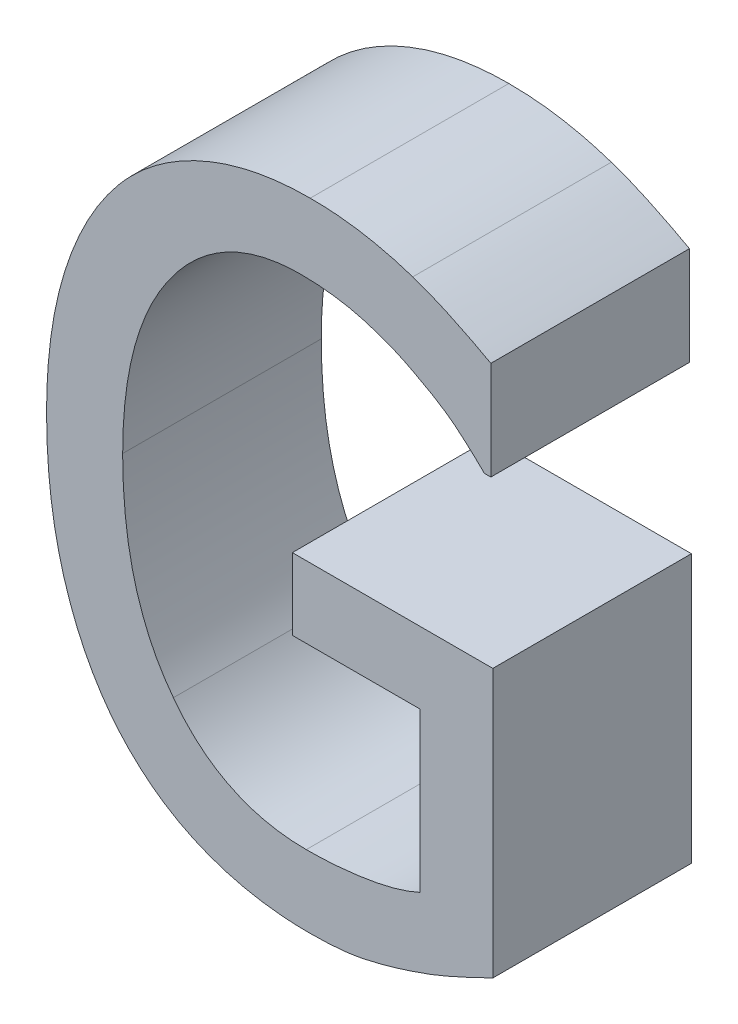
ISO-10303-21;
HEADER;
FILE_DESCRIPTION(('STEP AP214'),'2;1');
FILE_NAME('part.step','',(''),(''),'','','');
FILE_SCHEMA(('AUTOMOTIVE_DESIGN { 1 0 10303 214 1 1 1 1 }'));
ENDSEC;
DATA;
#1=APPLICATION_CONTEXT('core data for automotive mechanical design processes');
#2=APPLICATION_PROTOCOL_DEFINITION('international standard','automotive_design',2000,#1);
#3=PRODUCT_CONTEXT('',#1,'mechanical');
#4=PRODUCT('Part','Part','',(#3));
#5=PRODUCT_RELATED_PRODUCT_CATEGORY('part','',(#4));
#6=PRODUCT_DEFINITION_FORMATION('','',#4);
#7=PRODUCT_DEFINITION_CONTEXT('part definition',#1,'design');
#8=PRODUCT_DEFINITION('design','',#6,#7);
#9=PRODUCT_DEFINITION_SHAPE('','',#8);
#10=(LENGTH_UNIT() NAMED_UNIT(*) SI_UNIT(.MILLI.,.METRE.));
#11=(NAMED_UNIT(*) PLANE_ANGLE_UNIT() SI_UNIT($,.RADIAN.));
#12=(NAMED_UNIT(*) SI_UNIT($,.STERADIAN.) SOLID_ANGLE_UNIT());
#13=UNCERTAINTY_MEASURE_WITH_UNIT(LENGTH_MEASURE(1.E-05),#10,'distance_accuracy_value','');
#14=(GEOMETRIC_REPRESENTATION_CONTEXT(3) GLOBAL_UNCERTAINTY_ASSIGNED_CONTEXT((#13)) GLOBAL_UNIT_ASSIGNED_CONTEXT((#10,
#11,#12)) REPRESENTATION_CONTEXT('',''));
#15=CARTESIAN_POINT('',(0.,0.,0.));
#16=DIRECTION('',(0.,0.,1.));
#17=DIRECTION('',(1.,0.,0.));
#18=AXIS2_PLACEMENT_3D('',#15,#16,#17);
#19=CARTESIAN_POINT('',(-2.688889723779,0.344229422438077,0.));
#20=CARTESIAN_POINT('',(-2.688889723779,0.344229422438077,0.1));
#21=CARTESIAN_POINT('',(-2.688889723779,0.304902672714159,0.));
#22=CARTESIAN_POINT('',(-2.688889723779,0.304902672714159,0.1));
#23=CARTESIAN_POINT('',(-2.670103059898,0.244284370591941,0.));
#24=CARTESIAN_POINT('',(-2.670103059898,0.244284370591941,0.1));
#25=CARTESIAN_POINT('',(-2.652568840276,0.223744284748876,0.));
#26=CARTESIAN_POINT('',(-2.652568840276,0.223744284748876,0.1));
#27=B_SPLINE_SURFACE_WITH_KNOTS('',2,1,((#19,#20),(#21,#22),(#23,#24),(#25,#26)),.UNSPECIFIED.,
.F.,.F.,.F.,(3,1,3),(2,2),(-2.,-1.,0.),(0.,0.01),.UNSPECIFIED.);
#28=CARTESIAN_POINT('',(-2.652568840276,0.223744284748876,0.));
#29=CARTESIAN_POINT('',(-2.670103059898,0.244284370591941,0.));
#30=CARTESIAN_POINT('',(-2.688889723779,0.304902672714159,0.));
#31=CARTESIAN_POINT('',(-2.688889723779,0.344229422438077,0.));
#32=B_SPLINE_CURVE_WITH_KNOTS('',2,(#28,#29,#30,#31),.UNSPECIFIED.,.F.,.F.,(3,1,3),(0.,1.,2.),.UNSPECIFIED.);
#33=CARTESIAN_POINT('',(-2.652568840276,0.223744284748876,0.));
#34=VERTEX_POINT('',#33);
#35=CARTESIAN_POINT('',(-2.688889723779,0.344229422438077,0.));
#36=VERTEX_POINT('',#35);
#37=EDGE_CURVE('E11',#34,#36,#32,.T.);
#38=DIRECTION('',(0.,0.,1.));
#39=VECTOR('',#38,1.);
#40=CARTESIAN_POINT('',(-2.652568840276,0.223744284748876,0.));
#41=LINE('',#40,#39);
#42=CARTESIAN_POINT('',(-2.652568840276,0.223744284748876,0.1));
#43=VERTEX_POINT('',#42);
#44=EDGE_CURVE('E28',#34,#43,#41,.T.);
#45=CARTESIAN_POINT('',(-2.688889723779,0.344229422438077,0.1));
#46=CARTESIAN_POINT('',(-2.688889723779,0.304902672714159,0.1));
#47=CARTESIAN_POINT('',(-2.670103059898,0.244284370591941,0.1));
#48=CARTESIAN_POINT('',(-2.652568840276,0.223744284748876,0.1));
#49=B_SPLINE_CURVE_WITH_KNOTS('',2,(#45,#46,#47,#48),.UNSPECIFIED.,.F.,.F.,(3,1,3),(-2.,-1.,0.),.UNSPECIFIED.);
#50=CARTESIAN_POINT('',(-2.688889723779,0.344229422438077,0.1));
#51=VERTEX_POINT('',#50);
#52=EDGE_CURVE('E182',#51,#43,#49,.T.);
#53=DIRECTION('',(0.,0.,1.));
#54=VECTOR('',#53,1.);
#55=CARTESIAN_POINT('',(-2.688889723779,0.344229422438077,0.));
#56=LINE('',#55,#54);
#57=EDGE_CURVE('E454',#36,#51,#56,.T.);
#58=ORIENTED_EDGE('',*,*,#37,.F.);
#59=ORIENTED_EDGE('',*,*,#44,.T.);
#60=ORIENTED_EDGE('',*,*,#52,.F.);
#61=ORIENTED_EDGE('',*,*,#57,.F.);
#62=EDGE_LOOP('',(#58,#59,#60,#61));
#63=FACE_BOUND('',#62,.T.);
#64=ADVANCED_FACE('F17',(#63),#27,.T.);
#65=CARTESIAN_POINT('',(-2.652568840276,0.461708693906341,0.));
#66=CARTESIAN_POINT('',(-2.652568840276,0.461708693906341,0.1));
#67=CARTESIAN_POINT('',(-2.670103059898,0.440667630359786,0.));
#68=CARTESIAN_POINT('',(-2.670103059898,0.440667630359786,0.1));
#69=CARTESIAN_POINT('',(-2.688889723779,0.381552261348037,0.));
#70=CARTESIAN_POINT('',(-2.688889723779,0.381552261348037,0.1));
#71=CARTESIAN_POINT('',(-2.688889723779,0.344229422438077,0.));
#72=CARTESIAN_POINT('',(-2.688889723779,0.344229422438077,0.1));
#73=B_SPLINE_SURFACE_WITH_KNOTS('',2,1,((#65,#66),(#67,#68),(#69,#70),(#71,#72)),.UNSPECIFIED.,
.F.,.F.,.F.,(3,1,3),(2,2),(-2.,-1.,0.),(0.,0.01),.UNSPECIFIED.);
#74=CARTESIAN_POINT('',(-2.688889723779,0.344229422438077,0.));
#75=CARTESIAN_POINT('',(-2.688889723779,0.381552261348037,0.));
#76=CARTESIAN_POINT('',(-2.670103059898,0.440667630359786,0.));
#77=CARTESIAN_POINT('',(-2.652568840276,0.461708693906341,0.));
#78=B_SPLINE_CURVE_WITH_KNOTS('',2,(#74,#75,#76,#77),.UNSPECIFIED.,.F.,.F.,(3,1,3),(0.,1.,2.),.UNSPECIFIED.);
#79=CARTESIAN_POINT('',(-2.652568840276,0.461708693906341,0.));
#80=VERTEX_POINT('',#79);
#81=EDGE_CURVE('E447',#36,#80,#78,.T.);
#82=CARTESIAN_POINT('',(-2.652568840276,0.461708693906341,0.1));
#83=CARTESIAN_POINT('',(-2.670103059898,0.440667630359786,0.1));
#84=CARTESIAN_POINT('',(-2.688889723779,0.381552261348037,0.1));
#85=CARTESIAN_POINT('',(-2.688889723779,0.344229422438077,0.1));
#86=B_SPLINE_CURVE_WITH_KNOTS('',2,(#82,#83,#84,#85),.UNSPECIFIED.,.F.,.F.,(3,1,3),(-2.,-1.,0.),.UNSPECIFIED.);
#87=CARTESIAN_POINT('',(-2.652568840276,0.461708693906341,0.1));
#88=VERTEX_POINT('',#87);
#89=EDGE_CURVE('E443',#88,#51,#86,.T.);
#90=DIRECTION('',(0.,0.,1.));
#91=VECTOR('',#90,1.);
#92=CARTESIAN_POINT('',(-2.652568840276,0.461708693906341,0.));
#93=LINE('',#92,#91);
#94=EDGE_CURVE('E437',#80,#88,#93,.T.);
#95=ORIENTED_EDGE('',*,*,#81,.F.);
#96=ORIENTED_EDGE('',*,*,#57,.T.);
#97=ORIENTED_EDGE('',*,*,#89,.F.);
#98=ORIENTED_EDGE('',*,*,#94,.F.);
#99=EDGE_LOOP('',(#95,#96,#97,#98));
#100=FACE_BOUND('',#99,.T.);
#101=ADVANCED_FACE('F536',(#100),#73,.T.);
#102=CARTESIAN_POINT('',(-2.556130632354,0.504041309851195,0.));
#103=CARTESIAN_POINT('',(-2.556130632354,0.504041309851195,0.1));
#104=CARTESIAN_POINT('',(-2.58568831686,0.504041309851195,0.));
#105=CARTESIAN_POINT('',(-2.58568831686,0.504041309851195,0.1));
#106=CARTESIAN_POINT('',(-2.635535598357,0.481998290897661,0.));
#107=CARTESIAN_POINT('',(-2.635535598357,0.481998290897661,0.1));
#108=CARTESIAN_POINT('',(-2.652568840276,0.461708693906341,0.));
#109=CARTESIAN_POINT('',(-2.652568840276,0.461708693906341,0.1));
#110=B_SPLINE_SURFACE_WITH_KNOTS('',2,1,((#102,#103),(#104,#105),(#106,#107),(#108,#109)),
.UNSPECIFIED.,.F.,.F.,.F.,(3,1,3),(2,2),(-2.,-1.,0.),(0.,0.01),.UNSPECIFIED.);
#111=CARTESIAN_POINT('',(-2.652568840276,0.461708693906341,0.));
#112=CARTESIAN_POINT('',(-2.635535598357,0.481998290897661,0.));
#113=CARTESIAN_POINT('',(-2.58568831686,0.504041309851195,0.));
#114=CARTESIAN_POINT('',(-2.556130632354,0.504041309851195,0.));
#115=B_SPLINE_CURVE_WITH_KNOTS('',2,(#111,#112,#113,#114),.UNSPECIFIED.,.F.,.F.,(3,1,3),(0.,1.,
2.),.UNSPECIFIED.);
#116=CARTESIAN_POINT('',(-2.556130632354,0.504041309851195,0.));
#117=VERTEX_POINT('',#116);
#118=EDGE_CURVE('E430',#80,#117,#115,.T.);
#119=CARTESIAN_POINT('',(-2.556130632354,0.504041309851195,0.1));
#120=CARTESIAN_POINT('',(-2.58568831686,0.504041309851195,0.1));
#121=CARTESIAN_POINT('',(-2.635535598357,0.481998290897661,0.1));
#122=CARTESIAN_POINT('',(-2.652568840276,0.461708693906341,0.1));
#123=B_SPLINE_CURVE_WITH_KNOTS('',2,(#119,#120,#121,#122),.UNSPECIFIED.,.F.,.F.,(3,1,3),(-2.,
-1.,0.),.UNSPECIFIED.);
#124=CARTESIAN_POINT('',(-2.556130632354,0.504041309851195,0.1));
#125=VERTEX_POINT('',#124);
#126=EDGE_CURVE('E425',#125,#88,#123,.T.);
#127=DIRECTION('',(0.,0.,1.));
#128=VECTOR('',#127,1.);
#129=CARTESIAN_POINT('',(-2.556130632354,0.504041309851195,0.));
#130=LINE('',#129,#128);
#131=EDGE_CURVE('E419',#117,#125,#130,.T.);
#132=ORIENTED_EDGE('',*,*,#118,.F.);
#133=ORIENTED_EDGE('',*,*,#94,.T.);
#134=ORIENTED_EDGE('',*,*,#126,.F.);
#135=ORIENTED_EDGE('',*,*,#131,.F.);
#136=EDGE_LOOP('',(#132,#133,#134,#135));
#137=FACE_BOUND('',#136,.T.);
#138=ADVANCED_FACE('F532',(#137),#110,.T.);
#139=CARTESIAN_POINT('',(-2.504529928895,0.495524688891875,0.));
#140=CARTESIAN_POINT('',(-2.504529928895,0.495524688891875,0.1));
#141=CARTESIAN_POINT('',(-2.516302904927,0.49953251051979,0.));
#142=CARTESIAN_POINT('',(-2.516302904927,0.49953251051979,0.1));
#143=CARTESIAN_POINT('',(-2.542103256656,0.504041309851195,0.));
#144=CARTESIAN_POINT('',(-2.542103256656,0.504041309851195,0.1));
#145=CARTESIAN_POINT('',(-2.556130632354,0.504041309851195,0.));
#146=CARTESIAN_POINT('',(-2.556130632354,0.504041309851195,0.1));
#147=B_SPLINE_SURFACE_WITH_KNOTS('',2,1,((#139,#140),(#141,#142),(#143,#144),(#145,#146)),
.UNSPECIFIED.,.F.,.F.,.F.,(3,1,3),(2,2),(-2.,-1.,0.),(0.,0.01),.UNSPECIFIED.);
#148=CARTESIAN_POINT('',(-2.556130632354,0.504041309851195,0.));
#149=CARTESIAN_POINT('',(-2.542103256656,0.504041309851195,0.));
#150=CARTESIAN_POINT('',(-2.516302904927,0.49953251051979,0.));
#151=CARTESIAN_POINT('',(-2.504529928895,0.495524688891875,0.));
#152=B_SPLINE_CURVE_WITH_KNOTS('',2,(#148,#149,#150,#151),.UNSPECIFIED.,.F.,.F.,(3,1,3),(0.,1.,
2.),.UNSPECIFIED.);
#153=CARTESIAN_POINT('',(-2.504529928895,0.495524688891875,0.));
#154=VERTEX_POINT('',#153);
#155=EDGE_CURVE('E412',#117,#154,#152,.T.);
#156=CARTESIAN_POINT('',(-2.504529928895,0.495524688891875,0.1));
#157=CARTESIAN_POINT('',(-2.516302904927,0.49953251051979,0.1));
#158=CARTESIAN_POINT('',(-2.542103256656,0.504041309851195,0.1));
#159=CARTESIAN_POINT('',(-2.556130632354,0.504041309851195,0.1));
#160=B_SPLINE_CURVE_WITH_KNOTS('',2,(#156,#157,#158,#159),.UNSPECIFIED.,.F.,.F.,(3,1,3),(-2.,
-1.,0.),.UNSPECIFIED.);
#161=CARTESIAN_POINT('',(-2.504529928895,0.495524688891875,0.1));
#162=VERTEX_POINT('',#161);
#163=EDGE_CURVE('E407',#162,#125,#160,.T.);
#164=DIRECTION('',(0.,0.,1.));
#165=VECTOR('',#164,1.);
#166=CARTESIAN_POINT('',(-2.504529928895,0.495524688891875,0.));
#167=LINE('',#166,#165);
#168=EDGE_CURVE('E401',#154,#162,#167,.T.);
#169=ORIENTED_EDGE('',*,*,#155,.F.);
#170=ORIENTED_EDGE('',*,*,#131,.T.);
#171=ORIENTED_EDGE('',*,*,#163,.F.);
#172=ORIENTED_EDGE('',*,*,#168,.F.);
#173=EDGE_LOOP('',(#169,#170,#171,#172));
#174=FACE_BOUND('',#173,.T.);
#175=ADVANCED_FACE('F528',(#174),#147,.T.);
#176=CARTESIAN_POINT('',(-2.465203179171,0.477489491566257,0.));
#177=CARTESIAN_POINT('',(-2.465203179171,0.477489491566257,0.1));
#178=CARTESIAN_POINT('',(-2.47221686702,0.481497313194172,0.));
#179=CARTESIAN_POINT('',(-2.47221686702,0.481497313194172,0.1));
#180=CARTESIAN_POINT('',(-2.49526184138,0.492518822670939,0.));
#181=CARTESIAN_POINT('',(-2.49526184138,0.492518822670939,0.1));
#182=CARTESIAN_POINT('',(-2.504529928895,0.495524688891875,0.));
#183=CARTESIAN_POINT('',(-2.504529928895,0.495524688891875,0.1));
#184=B_SPLINE_SURFACE_WITH_KNOTS('',2,1,((#176,#177),(#178,#179),(#180,#181),(#182,#183)),
.UNSPECIFIED.,.F.,.F.,.F.,(3,1,3),(2,2),(-2.,-1.,0.),(0.,0.01),.UNSPECIFIED.);
#185=CARTESIAN_POINT('',(-2.504529928895,0.495524688891875,0.));
#186=CARTESIAN_POINT('',(-2.49526184138,0.492518822670939,0.));
#187=CARTESIAN_POINT('',(-2.47221686702,0.481497313194172,0.));
#188=CARTESIAN_POINT('',(-2.465203179171,0.477489491566257,0.));
#189=B_SPLINE_CURVE_WITH_KNOTS('',2,(#185,#186,#187,#188),.UNSPECIFIED.,.F.,.F.,(3,1,3),(0.,1.,
2.),.UNSPECIFIED.);
#190=CARTESIAN_POINT('',(-2.465203179171,0.477489491566257,0.));
#191=VERTEX_POINT('',#190);
#192=EDGE_CURVE('E394',#154,#191,#189,.T.);
#193=CARTESIAN_POINT('',(-2.465203179171,0.477489491566257,0.1));
#194=CARTESIAN_POINT('',(-2.47221686702,0.481497313194172,0.1));
#195=CARTESIAN_POINT('',(-2.49526184138,0.492518822670939,0.1));
#196=CARTESIAN_POINT('',(-2.504529928895,0.495524688891875,0.1));
#197=B_SPLINE_CURVE_WITH_KNOTS('',2,(#193,#194,#195,#196),.UNSPECIFIED.,.F.,.F.,(3,1,3),(-2.,
-1.,0.),.UNSPECIFIED.);
#198=CARTESIAN_POINT('',(-2.465203179171,0.477489491566257,0.1));
#199=VERTEX_POINT('',#198);
#200=EDGE_CURVE('E389',#199,#162,#197,.T.);
#201=DIRECTION('',(0.,0.,1.));
#202=VECTOR('',#201,1.);
#203=CARTESIAN_POINT('',(-2.465203179171,0.477489491566257,0.));
#204=LINE('',#203,#202);
#205=EDGE_CURVE('E386',#191,#199,#204,.T.);
#206=ORIENTED_EDGE('',*,*,#192,.F.);
#207=ORIENTED_EDGE('',*,*,#168,.T.);
#208=ORIENTED_EDGE('',*,*,#200,.F.);
#209=ORIENTED_EDGE('',*,*,#205,.F.);
#210=EDGE_LOOP('',(#206,#207,#208,#209));
#211=FACE_BOUND('',#210,.T.);
#212=ADVANCED_FACE('F524',(#211),#184,.T.);
#213=CARTESIAN_POINT('',(-2.465203179171,0.427892698920806,0.));
#214=DIRECTION('',(1.,0.,0.));
#215=DIRECTION('',(0.,1.,0.));
#216=AXIS2_PLACEMENT_3D('',#213,#214,#215);
#217=PLANE('',#216);
#218=DIRECTION('',(0.,-1.,0.));
#219=VECTOR('',#218,1.);
#220=CARTESIAN_POINT('',(-2.465203179171,0.477489491566257,0.));
#221=LINE('',#220,#219);
#222=CARTESIAN_POINT('',(-2.465203179171,0.427892698920806,0.));
#223=VERTEX_POINT('',#222);
#224=EDGE_CURVE('E384',#191,#223,#221,.T.);
#225=ORIENTED_EDGE('',*,*,#224,.F.);
#226=ORIENTED_EDGE('',*,*,#205,.T.);
#227=DIRECTION('',(0.,1.,0.));
#228=VECTOR('',#227,1.);
#229=CARTESIAN_POINT('',(-2.465203179171,0.477489491566257,0.1));
#230=LINE('',#229,#228);
#231=CARTESIAN_POINT('',(-2.465203179171,0.427892698920806,0.1));
#232=VERTEX_POINT('',#231);
#233=EDGE_CURVE('E381',#232,#199,#230,.T.);
#234=ORIENTED_EDGE('',*,*,#233,.F.);
#235=DIRECTION('',(0.,0.,1.));
#236=VECTOR('',#235,1.);
#237=CARTESIAN_POINT('',(-2.465203179171,0.427892698920806,0.));
#238=LINE('',#237,#236);
#239=EDGE_CURVE('E378',#223,#232,#238,.T.);
#240=ORIENTED_EDGE('',*,*,#239,.F.);
#241=EDGE_LOOP('',(#225,#226,#234,#240));
#242=FACE_BOUND('',#241,.T.);
#243=ADVANCED_FACE('F520',(#242),#217,.T.);
#244=CARTESIAN_POINT('',(-2.468459534243,0.427892698920806,0.));
#245=DIRECTION('',(0.,-1.,0.));
#246=DIRECTION('',(1.,0.,0.));
#247=AXIS2_PLACEMENT_3D('',#244,#245,#246);
#248=PLANE('',#247);
#249=DIRECTION('',(-1.,0.,0.));
#250=VECTOR('',#249,1.);
#251=CARTESIAN_POINT('',(-2.465203179171,0.427892698920806,0.));
#252=LINE('',#251,#250);
#253=CARTESIAN_POINT('',(-2.468459534243,0.427892698920806,0.));
#254=VERTEX_POINT('',#253);
#255=EDGE_CURVE('E376',#223,#254,#252,.T.);
#256=ORIENTED_EDGE('',*,*,#255,.F.);
#257=ORIENTED_EDGE('',*,*,#239,.T.);
#258=DIRECTION('',(1.,0.,0.));
#259=VECTOR('',#258,1.);
#260=CARTESIAN_POINT('',(-2.465203179171,0.427892698920806,0.1));
#261=LINE('',#260,#259);
#262=CARTESIAN_POINT('',(-2.468459534243,0.427892698920806,0.1));
#263=VERTEX_POINT('',#262);
#264=EDGE_CURVE('E373',#263,#232,#261,.T.);
#265=ORIENTED_EDGE('',*,*,#264,.F.);
#266=DIRECTION('',(0.,0.,1.));
#267=VECTOR('',#266,1.);
#268=CARTESIAN_POINT('',(-2.468459534243,0.427892698920806,0.));
#269=LINE('',#268,#267);
#270=EDGE_CURVE('E367',#254,#263,#269,.T.);
#271=ORIENTED_EDGE('',*,*,#270,.F.);
#272=EDGE_LOOP('',(#256,#257,#265,#271));
#273=FACE_BOUND('',#272,.T.);
#274=ADVANCED_FACE('F516',(#273),#248,.T.);
#275=CARTESIAN_POINT('',(-2.503527973488,0.453943539502255,0.));
#276=CARTESIAN_POINT('',(-2.503527973488,0.453943539502255,0.1));
#277=CARTESIAN_POINT('',(-2.490001575494,0.446929851653403,0.));
#278=CARTESIAN_POINT('',(-2.490001575494,0.446929851653403,0.1));
#279=CARTESIAN_POINT('',(-2.475222733241,0.434655897917913,0.));
#280=CARTESIAN_POINT('',(-2.475222733241,0.434655897917913,0.1));
#281=CARTESIAN_POINT('',(-2.468459534243,0.427892698920806,0.));
#282=CARTESIAN_POINT('',(-2.468459534243,0.427892698920806,0.1));
#283=B_SPLINE_SURFACE_WITH_KNOTS('',2,1,((#275,#276),(#277,#278),(#279,#280),(#281,#282)),
.UNSPECIFIED.,.F.,.F.,.F.,(3,1,3),(2,2),(-2.,-1.,0.),(0.,0.01),.UNSPECIFIED.);
#284=CARTESIAN_POINT('',(-2.468459534243,0.427892698920806,0.));
#285=CARTESIAN_POINT('',(-2.475222733241,0.434655897917913,0.));
#286=CARTESIAN_POINT('',(-2.490001575494,0.446929851653403,0.));
#287=CARTESIAN_POINT('',(-2.503527973488,0.453943539502255,0.));
#288=B_SPLINE_CURVE_WITH_KNOTS('',2,(#284,#285,#286,#287),.UNSPECIFIED.,.F.,.F.,(3,1,3),(0.,1.,
2.),.UNSPECIFIED.);
#289=CARTESIAN_POINT('',(-2.503527973488,0.453943539502255,0.));
#290=VERTEX_POINT('',#289);
#291=EDGE_CURVE('E360',#254,#290,#288,.T.);
#292=CARTESIAN_POINT('',(-2.503527973488,0.453943539502255,0.1));
#293=CARTESIAN_POINT('',(-2.490001575494,0.446929851653403,0.1));
#294=CARTESIAN_POINT('',(-2.475222733241,0.434655897917913,0.1));
#295=CARTESIAN_POINT('',(-2.468459534243,0.427892698920806,0.1));
#296=B_SPLINE_CURVE_WITH_KNOTS('',2,(#292,#293,#294,#295),.UNSPECIFIED.,.F.,.F.,(3,1,3),(-2.,
-1.,0.),.UNSPECIFIED.);
#297=CARTESIAN_POINT('',(-2.503527973488,0.453943539502255,0.1));
#298=VERTEX_POINT('',#297);
#299=EDGE_CURVE('E355',#298,#263,#296,.T.);
#300=DIRECTION('',(0.,0.,1.));
#301=VECTOR('',#300,1.);
#302=CARTESIAN_POINT('',(-2.503527973488,0.453943539502255,0.));
#303=LINE('',#302,#301);
#304=EDGE_CURVE('E349',#290,#298,#303,.T.);
#305=ORIENTED_EDGE('',*,*,#291,.F.);
#306=ORIENTED_EDGE('',*,*,#270,.T.);
#307=ORIENTED_EDGE('',*,*,#299,.F.);
#308=ORIENTED_EDGE('',*,*,#304,.F.);
#309=EDGE_LOOP('',(#305,#306,#307,#308));
#310=FACE_BOUND('',#309,.T.);
#311=ADVANCED_FACE('F512',(#310),#283,.T.);
#312=CARTESIAN_POINT('',(-2.560889920537,0.468471892903448,0.));
#313=CARTESIAN_POINT('',(-2.560889920537,0.468471892903448,0.1));
#314=CARTESIAN_POINT('',(-2.543856678619,0.468471892903448,0.));
#315=CARTESIAN_POINT('',(-2.543856678619,0.468471892903448,0.1));
#316=CARTESIAN_POINT('',(-2.514799971816,0.460205760795873,0.));
#317=CARTESIAN_POINT('',(-2.514799971816,0.460205760795873,0.1));
#318=CARTESIAN_POINT('',(-2.503527973488,0.453943539502255,0.));
#319=CARTESIAN_POINT('',(-2.503527973488,0.453943539502255,0.1));
#320=B_SPLINE_SURFACE_WITH_KNOTS('',2,1,((#312,#313),(#314,#315),(#316,#317),(#318,#319)),
.UNSPECIFIED.,.F.,.F.,.F.,(3,1,3),(2,2),(-2.,-1.,0.),(0.,0.01),.UNSPECIFIED.);
#321=CARTESIAN_POINT('',(-2.503527973488,0.453943539502255,0.));
#322=CARTESIAN_POINT('',(-2.514799971816,0.460205760795873,0.));
#323=CARTESIAN_POINT('',(-2.543856678619,0.468471892903448,0.));
#324=CARTESIAN_POINT('',(-2.560889920537,0.468471892903448,0.));
#325=B_SPLINE_CURVE_WITH_KNOTS('',2,(#321,#322,#323,#324),.UNSPECIFIED.,.F.,.F.,(3,1,3),(0.,1.,
2.),.UNSPECIFIED.);
#326=CARTESIAN_POINT('',(-2.560889920537,0.468471892903448,0.));
#327=VERTEX_POINT('',#326);
#328=EDGE_CURVE('E342',#290,#327,#325,.T.);
#329=CARTESIAN_POINT('',(-2.560889920537,0.468471892903448,0.1));
#330=CARTESIAN_POINT('',(-2.543856678619,0.468471892903448,0.1));
#331=CARTESIAN_POINT('',(-2.514799971816,0.460205760795873,0.1));
#332=CARTESIAN_POINT('',(-2.503527973488,0.453943539502255,0.1));
#333=B_SPLINE_CURVE_WITH_KNOTS('',2,(#329,#330,#331,#332),.UNSPECIFIED.,.F.,.F.,(3,1,3),(-2.,
-1.,0.),.UNSPECIFIED.);
#334=CARTESIAN_POINT('',(-2.560889920537,0.468471892903448,0.1));
#335=VERTEX_POINT('',#334);
#336=EDGE_CURVE('E337',#335,#298,#333,.T.);
#337=DIRECTION('',(0.,0.,1.));
#338=VECTOR('',#337,1.);
#339=CARTESIAN_POINT('',(-2.560889920537,0.468471892903448,0.));
#340=LINE('',#339,#338);
#341=EDGE_CURVE('E331',#327,#335,#340,.T.);
#342=ORIENTED_EDGE('',*,*,#328,.F.);
#343=ORIENTED_EDGE('',*,*,#304,.T.);
#344=ORIENTED_EDGE('',*,*,#336,.F.);
#345=ORIENTED_EDGE('',*,*,#341,.F.);
#346=EDGE_LOOP('',(#342,#343,#344,#345));
#347=FACE_BOUND('',#346,.T.);
#348=ADVANCED_FACE('F508',(#347),#320,.T.);
#349=CARTESIAN_POINT('',(-2.650564929462,0.3454818666968,0.));
#350=CARTESIAN_POINT('',(-2.650564929462,0.3454818666968,0.1));
#351=CARTESIAN_POINT('',(-2.650564929462,0.401340880635868,0.));
#352=CARTESIAN_POINT('',(-2.650564929462,0.401340880635868,0.1));
#353=CARTESIAN_POINT('',(-2.600968136816,0.468471892903448,0.));
#354=CARTESIAN_POINT('',(-2.600968136816,0.468471892903448,0.1));
#355=CARTESIAN_POINT('',(-2.560889920537,0.468471892903448,0.));
#356=CARTESIAN_POINT('',(-2.560889920537,0.468471892903448,0.1));
#357=B_SPLINE_SURFACE_WITH_KNOTS('',2,1,((#349,#350),(#351,#352),(#353,#354),(#355,#356)),
.UNSPECIFIED.,.F.,.F.,.F.,(3,1,3),(2,2),(-2.,-1.,0.),(0.,0.01),.UNSPECIFIED.);
#358=CARTESIAN_POINT('',(-2.560889920537,0.468471892903448,0.));
#359=CARTESIAN_POINT('',(-2.600968136816,0.468471892903448,0.));
#360=CARTESIAN_POINT('',(-2.650564929462,0.401340880635868,0.));
#361=CARTESIAN_POINT('',(-2.650564929462,0.3454818666968,0.));
#362=B_SPLINE_CURVE_WITH_KNOTS('',2,(#358,#359,#360,#361),.UNSPECIFIED.,.F.,.F.,(3,1,3),(0.,1.,
2.),.UNSPECIFIED.);
#363=CARTESIAN_POINT('',(-2.650564929462,0.3454818666968,0.));
#364=VERTEX_POINT('',#363);
#365=EDGE_CURVE('E324',#327,#364,#362,.T.);
#366=CARTESIAN_POINT('',(-2.650564929462,0.3454818666968,0.1));
#367=CARTESIAN_POINT('',(-2.650564929462,0.401340880635868,0.1));
#368=CARTESIAN_POINT('',(-2.600968136816,0.468471892903448,0.1));
#369=CARTESIAN_POINT('',(-2.560889920537,0.468471892903448,0.1));
#370=B_SPLINE_CURVE_WITH_KNOTS('',2,(#366,#367,#368,#369),.UNSPECIFIED.,.F.,.F.,(3,1,3),(-2.,
-1.,0.),.UNSPECIFIED.);
#371=CARTESIAN_POINT('',(-2.650564929462,0.3454818666968,0.1));
#372=VERTEX_POINT('',#371);
#373=EDGE_CURVE('E319',#372,#335,#370,.T.);
#374=DIRECTION('',(0.,0.,1.));
#375=VECTOR('',#374,1.);
#376=CARTESIAN_POINT('',(-2.650564929462,0.3454818666968,0.));
#377=LINE('',#376,#375);
#378=EDGE_CURVE('E313',#364,#372,#377,.T.);
#379=ORIENTED_EDGE('',*,*,#365,.F.);
#380=ORIENTED_EDGE('',*,*,#341,.T.);
#381=ORIENTED_EDGE('',*,*,#373,.F.);
#382=ORIENTED_EDGE('',*,*,#378,.F.);
#383=EDGE_LOOP('',(#379,#380,#381,#382));
#384=FACE_BOUND('',#383,.T.);
#385=ADVANCED_FACE('F504',(#384),#357,.T.);
#386=CARTESIAN_POINT('',(-2.625015066584,0.251799036144282,0.));
#387=CARTESIAN_POINT('',(-2.625015066584,0.251799036144282,0.1));
#388=CARTESIAN_POINT('',(-2.637539509171,0.267830322655943,0.));
#389=CARTESIAN_POINT('',(-2.637539509171,0.267830322655943,0.1));
#390=CARTESIAN_POINT('',(-2.650564929462,0.314421249080457,0.));
#391=CARTESIAN_POINT('',(-2.650564929462,0.314421249080457,0.1));
#392=CARTESIAN_POINT('',(-2.650564929462,0.3454818666968,0.));
#393=CARTESIAN_POINT('',(-2.650564929462,0.3454818666968,0.1));
#394=B_SPLINE_SURFACE_WITH_KNOTS('',2,1,((#386,#387),(#388,#389),(#390,#391),(#392,#393)),
.UNSPECIFIED.,.F.,.F.,.F.,(3,1,3),(2,2),(-2.,-1.,0.),(0.,0.01),.UNSPECIFIED.);
#395=CARTESIAN_POINT('',(-2.650564929462,0.3454818666968,0.));
#396=CARTESIAN_POINT('',(-2.650564929462,0.314421249080457,0.));
#397=CARTESIAN_POINT('',(-2.637539509171,0.267830322655943,0.));
#398=CARTESIAN_POINT('',(-2.625015066584,0.251799036144282,0.));
#399=B_SPLINE_CURVE_WITH_KNOTS('',2,(#395,#396,#397,#398),.UNSPECIFIED.,.F.,.F.,(3,1,3),(0.,1.,
2.),.UNSPECIFIED.);
#400=CARTESIAN_POINT('',(-2.625015066584,0.251799036144282,0.));
#401=VERTEX_POINT('',#400);
#402=EDGE_CURVE('E306',#364,#401,#399,.T.);
#403=CARTESIAN_POINT('',(-2.625015066584,0.251799036144282,0.1));
#404=CARTESIAN_POINT('',(-2.637539509171,0.267830322655943,0.1));
#405=CARTESIAN_POINT('',(-2.650564929462,0.314421249080457,0.1));
#406=CARTESIAN_POINT('',(-2.650564929462,0.3454818666968,0.1));
#407=B_SPLINE_CURVE_WITH_KNOTS('',2,(#403,#404,#405,#406),.UNSPECIFIED.,.F.,.F.,(3,1,3),(-2.,
-1.,0.),.UNSPECIFIED.);
#408=CARTESIAN_POINT('',(-2.625015066584,0.251799036144282,0.1));
#409=VERTEX_POINT('',#408);
#410=EDGE_CURVE('E301',#409,#372,#407,.T.);
#411=DIRECTION('',(0.,0.,1.));
#412=VECTOR('',#411,1.);
#413=CARTESIAN_POINT('',(-2.625015066584,0.251799036144282,0.));
#414=LINE('',#413,#412);
#415=EDGE_CURVE('E295',#401,#409,#414,.T.);
#416=ORIENTED_EDGE('',*,*,#402,.F.);
#417=ORIENTED_EDGE('',*,*,#378,.T.);
#418=ORIENTED_EDGE('',*,*,#410,.F.);
#419=ORIENTED_EDGE('',*,*,#415,.F.);
#420=EDGE_LOOP('',(#416,#417,#418,#419));
#421=FACE_BOUND('',#420,.T.);
#422=ADVANCED_FACE('F500',(#421),#394,.T.);
#423=CARTESIAN_POINT('',(-2.558134543168,0.218984996565727,0.));
#424=CARTESIAN_POINT('',(-2.558134543168,0.218984996565727,0.1));
#425=CARTESIAN_POINT('',(-2.579426095566,0.218984996565727,0.));
#426=CARTESIAN_POINT('',(-2.579426095566,0.218984996565727,0.1));
#427=CARTESIAN_POINT('',(-2.613242090552,0.235767749632622,0.));
#428=CARTESIAN_POINT('',(-2.613242090552,0.235767749632622,0.1));
#429=CARTESIAN_POINT('',(-2.625015066584,0.251799036144282,0.));
#430=CARTESIAN_POINT('',(-2.625015066584,0.251799036144282,0.1));
#431=B_SPLINE_SURFACE_WITH_KNOTS('',2,1,((#423,#424),(#425,#426),(#427,#428),(#429,#430)),
.UNSPECIFIED.,.F.,.F.,.F.,(3,1,3),(2,2),(-2.,-1.,0.),(0.,0.01),.UNSPECIFIED.);
#432=CARTESIAN_POINT('',(-2.625015066584,0.251799036144282,0.));
#433=CARTESIAN_POINT('',(-2.613242090552,0.235767749632622,0.));
#434=CARTESIAN_POINT('',(-2.579426095566,0.218984996565727,0.));
#435=CARTESIAN_POINT('',(-2.558134543168,0.218984996565727,0.));
#436=B_SPLINE_CURVE_WITH_KNOTS('',2,(#432,#433,#434,#435),.UNSPECIFIED.,.F.,.F.,(3,1,3),(0.,1.,
2.),.UNSPECIFIED.);
#437=CARTESIAN_POINT('',(-2.558134543168,0.218984996565727,0.));
#438=VERTEX_POINT('',#437);
#439=EDGE_CURVE('E288',#401,#438,#436,.T.);
#440=CARTESIAN_POINT('',(-2.558134543168,0.218984996565727,0.1));
#441=CARTESIAN_POINT('',(-2.579426095566,0.218984996565727,0.1));
#442=CARTESIAN_POINT('',(-2.613242090552,0.235767749632622,0.1));
#443=CARTESIAN_POINT('',(-2.625015066584,0.251799036144282,0.1));
#444=B_SPLINE_CURVE_WITH_KNOTS('',2,(#440,#441,#442,#443),.UNSPECIFIED.,.F.,.F.,(3,1,3),(-2.,
-1.,0.),.UNSPECIFIED.);
#445=CARTESIAN_POINT('',(-2.558134543168,0.218984996565727,0.1));
#446=VERTEX_POINT('',#445);
#447=EDGE_CURVE('E283',#446,#409,#444,.T.);
#448=DIRECTION('',(0.,0.,1.));
#449=VECTOR('',#448,1.);
#450=CARTESIAN_POINT('',(-2.558134543168,0.218984996565727,0.));
#451=LINE('',#450,#449);
#452=EDGE_CURVE('E277',#438,#446,#451,.T.);
#453=ORIENTED_EDGE('',*,*,#439,.F.);
#454=ORIENTED_EDGE('',*,*,#415,.T.);
#455=ORIENTED_EDGE('',*,*,#447,.F.);
#456=ORIENTED_EDGE('',*,*,#452,.F.);
#457=EDGE_LOOP('',(#453,#454,#455,#456));
#458=FACE_BOUND('',#457,.T.);
#459=ADVANCED_FACE('F496',(#458),#431,.T.);
#460=CARTESIAN_POINT('',(-2.500772596119,0.229004550635515,0.));
#461=CARTESIAN_POINT('',(-2.500772596119,0.229004550635515,0.1));
#462=CARTESIAN_POINT('',(-2.511543616744,0.223994773600621,0.));
#463=CARTESIAN_POINT('',(-2.511543616744,0.223994773600621,0.1));
#464=CARTESIAN_POINT('',(-2.542353745508,0.218984996565727,0.));
#465=CARTESIAN_POINT('',(-2.542353745508,0.218984996565727,0.1));
#466=CARTESIAN_POINT('',(-2.558134543168,0.218984996565727,0.));
#467=CARTESIAN_POINT('',(-2.558134543168,0.218984996565727,0.1));
#468=B_SPLINE_SURFACE_WITH_KNOTS('',2,1,((#460,#461),(#462,#463),(#464,#465),(#466,#467)),
.UNSPECIFIED.,.F.,.F.,.F.,(3,1,3),(2,2),(-2.,-1.,0.),(0.,0.01),.UNSPECIFIED.);
#469=CARTESIAN_POINT('',(-2.558134543168,0.218984996565727,0.));
#470=CARTESIAN_POINT('',(-2.542353745508,0.218984996565727,0.));
#471=CARTESIAN_POINT('',(-2.511543616744,0.223994773600621,0.));
#472=CARTESIAN_POINT('',(-2.500772596119,0.229004550635515,0.));
#473=B_SPLINE_CURVE_WITH_KNOTS('',2,(#469,#470,#471,#472),.UNSPECIFIED.,.F.,.F.,(3,1,3),(0.,1.,
2.),.UNSPECIFIED.);
#474=CARTESIAN_POINT('',(-2.500772596119,0.229004550635515,0.));
#475=VERTEX_POINT('',#474);
#476=EDGE_CURVE('E270',#438,#475,#473,.T.);
#477=CARTESIAN_POINT('',(-2.500772596119,0.229004550635515,0.1));
#478=CARTESIAN_POINT('',(-2.511543616744,0.223994773600621,0.1));
#479=CARTESIAN_POINT('',(-2.542353745508,0.218984996565727,0.1));
#480=CARTESIAN_POINT('',(-2.558134543168,0.218984996565727,0.1));
#481=B_SPLINE_CURVE_WITH_KNOTS('',2,(#477,#478,#479,#480),.UNSPECIFIED.,.F.,.F.,(3,1,3),(-2.,
-1.,0.),.UNSPECIFIED.);
#482=CARTESIAN_POINT('',(-2.500772596119,0.229004550635515,0.1));
#483=VERTEX_POINT('',#482);
#484=EDGE_CURVE('E265',#483,#446,#481,.T.);
#485=DIRECTION('',(0.,0.,1.));
#486=VECTOR('',#485,1.);
#487=CARTESIAN_POINT('',(-2.500772596119,0.229004550635515,0.));
#488=LINE('',#487,#486);
#489=EDGE_CURVE('E262',#475,#483,#488,.T.);
#490=ORIENTED_EDGE('',*,*,#476,.F.);
#491=ORIENTED_EDGE('',*,*,#452,.T.);
#492=ORIENTED_EDGE('',*,*,#484,.F.);
#493=ORIENTED_EDGE('',*,*,#489,.F.);
#494=EDGE_LOOP('',(#490,#491,#492,#493));
#495=FACE_BOUND('',#494,.T.);
#496=ADVANCED_FACE('F492',(#495),#468,.T.);
#497=CARTESIAN_POINT('',(-2.500772596119,0.308910494342074,0.));
#498=DIRECTION('',(-1.,0.,0.));
#499=DIRECTION('',(0.,-1.,0.));
#500=AXIS2_PLACEMENT_3D('',#497,#498,#499);
#501=PLANE('',#500);
#502=DIRECTION('',(0.,1.,0.));
#503=VECTOR('',#502,1.);
#504=CARTESIAN_POINT('',(-2.500772596119,0.229004550635515,0.));
#505=LINE('',#504,#503);
#506=CARTESIAN_POINT('',(-2.500772596119,0.308910494342074,0.));
#507=VERTEX_POINT('',#506);
#508=EDGE_CURVE('E260',#475,#507,#505,.T.);
#509=ORIENTED_EDGE('',*,*,#508,.F.);
#510=ORIENTED_EDGE('',*,*,#489,.T.);
#511=DIRECTION('',(0.,-1.,0.));
#512=VECTOR('',#511,1.);
#513=CARTESIAN_POINT('',(-2.500772596119,0.229004550635515,0.1));
#514=LINE('',#513,#512);
#515=CARTESIAN_POINT('',(-2.500772596119,0.308910494342074,0.1));
#516=VERTEX_POINT('',#515);
#517=EDGE_CURVE('E257',#516,#483,#514,.T.);
#518=ORIENTED_EDGE('',*,*,#517,.F.);
#519=DIRECTION('',(0.,0.,1.));
#520=VECTOR('',#519,1.);
#521=CARTESIAN_POINT('',(-2.500772596119,0.308910494342074,0.));
#522=LINE('',#521,#520);
#523=EDGE_CURVE('E254',#507,#516,#522,.T.);
#524=ORIENTED_EDGE('',*,*,#523,.F.);
#525=EDGE_LOOP('',(#509,#510,#518,#524));
#526=FACE_BOUND('',#525,.T.);
#527=ADVANCED_FACE('F488',(#526),#501,.T.);
#528=CARTESIAN_POINT('',(-2.565148231017,0.308910494342074,0.));
#529=DIRECTION('',(0.,-1.,0.));
#530=DIRECTION('',(1.,0.,0.));
#531=AXIS2_PLACEMENT_3D('',#528,#529,#530);
#532=PLANE('',#531);
#533=DIRECTION('',(-1.,0.,0.));
#534=VECTOR('',#533,1.);
#535=CARTESIAN_POINT('',(-2.500772596119,0.308910494342074,0.));
#536=LINE('',#535,#534);
#537=CARTESIAN_POINT('',(-2.565148231017,0.308910494342074,0.));
#538=VERTEX_POINT('',#537);
#539=EDGE_CURVE('E252',#507,#538,#536,.T.);
#540=ORIENTED_EDGE('',*,*,#539,.F.);
#541=ORIENTED_EDGE('',*,*,#523,.T.);
#542=DIRECTION('',(1.,0.,0.));
#543=VECTOR('',#542,1.);
#544=CARTESIAN_POINT('',(-2.500772596119,0.308910494342074,0.1));
#545=LINE('',#544,#543);
#546=CARTESIAN_POINT('',(-2.565148231017,0.308910494342074,0.1));
#547=VERTEX_POINT('',#546);
#548=EDGE_CURVE('E249',#547,#516,#545,.T.);
#549=ORIENTED_EDGE('',*,*,#548,.F.);
#550=DIRECTION('',(0.,0.,1.));
#551=VECTOR('',#550,1.);
#552=CARTESIAN_POINT('',(-2.565148231017,0.308910494342074,0.));
#553=LINE('',#552,#551);
#554=EDGE_CURVE('E246',#538,#547,#553,.T.);
#555=ORIENTED_EDGE('',*,*,#554,.F.);
#556=EDGE_LOOP('',(#540,#541,#549,#555));
#557=FACE_BOUND('',#556,.T.);
#558=ADVANCED_FACE('F484',(#557),#532,.T.);
#559=CARTESIAN_POINT('',(-2.565148231017,0.344980888993311,0.));
#560=DIRECTION('',(-1.,0.,0.));
#561=DIRECTION('',(0.,-1.,0.));
#562=AXIS2_PLACEMENT_3D('',#559,#560,#561);
#563=PLANE('',#562);
#564=DIRECTION('',(0.,1.,0.));
#565=VECTOR('',#564,1.);
#566=CARTESIAN_POINT('',(-2.565148231017,0.308910494342074,0.));
#567=LINE('',#566,#565);
#568=CARTESIAN_POINT('',(-2.565148231017,0.344980888993311,0.));
#569=VERTEX_POINT('',#568);
#570=EDGE_CURVE('E244',#538,#569,#567,.T.);
#571=ORIENTED_EDGE('',*,*,#570,.F.);
#572=ORIENTED_EDGE('',*,*,#554,.T.);
#573=DIRECTION('',(0.,-1.,0.));
#574=VECTOR('',#573,1.);
#575=CARTESIAN_POINT('',(-2.565148231017,0.308910494342074,0.1));
#576=LINE('',#575,#574);
#577=CARTESIAN_POINT('',(-2.565148231017,0.344980888993311,0.1));
#578=VERTEX_POINT('',#577);
#579=EDGE_CURVE('E241',#578,#547,#576,.T.);
#580=ORIENTED_EDGE('',*,*,#579,.F.);
#581=DIRECTION('',(0.,0.,1.));
#582=VECTOR('',#581,1.);
#583=CARTESIAN_POINT('',(-2.565148231017,0.344980888993311,0.));
#584=LINE('',#583,#582);
#585=EDGE_CURVE('E238',#569,#578,#584,.T.);
#586=ORIENTED_EDGE('',*,*,#585,.F.);
#587=EDGE_LOOP('',(#571,#572,#580,#586));
#588=FACE_BOUND('',#587,.T.);
#589=ADVANCED_FACE('F480',(#588),#563,.T.);
#590=CARTESIAN_POINT('',(-2.464201223764,0.344980888993311,0.));
#591=DIRECTION('',(0.,1.,0.));
#592=DIRECTION('',(-1.,0.,0.));
#593=AXIS2_PLACEMENT_3D('',#590,#591,#592);
#594=PLANE('',#593);
#595=DIRECTION('',(1.,0.,0.));
#596=VECTOR('',#595,1.);
#597=CARTESIAN_POINT('',(-2.565148231017,0.344980888993311,0.));
#598=LINE('',#597,#596);
#599=CARTESIAN_POINT('',(-2.464201223764,0.344980888993311,0.));
#600=VERTEX_POINT('',#599);
#601=EDGE_CURVE('E236',#569,#600,#598,.T.);
#602=ORIENTED_EDGE('',*,*,#601,.F.);
#603=ORIENTED_EDGE('',*,*,#585,.T.);
#604=DIRECTION('',(-1.,0.,0.));
#605=VECTOR('',#604,1.);
#606=CARTESIAN_POINT('',(-2.565148231017,0.344980888993311,0.1));
#607=LINE('',#606,#605);
#608=CARTESIAN_POINT('',(-2.464201223764,0.344980888993311,0.1));
#609=VERTEX_POINT('',#608);
#610=EDGE_CURVE('E233',#609,#578,#607,.T.);
#611=ORIENTED_EDGE('',*,*,#610,.F.);
#612=DIRECTION('',(0.,0.,1.));
#613=VECTOR('',#612,1.);
#614=CARTESIAN_POINT('',(-2.464201223764,0.344980888993311,0.));
#615=LINE('',#614,#613);
#616=EDGE_CURVE('E230',#600,#609,#615,.T.);
#617=ORIENTED_EDGE('',*,*,#616,.F.);
#618=EDGE_LOOP('',(#602,#603,#611,#617));
#619=FACE_BOUND('',#618,.T.);
#620=ADVANCED_FACE('F476',(#619),#594,.T.);
#621=CARTESIAN_POINT('',(-2.464201223764,0.209967397902918,0.));
#622=DIRECTION('',(1.,0.,0.));
#623=DIRECTION('',(0.,1.,0.));
#624=AXIS2_PLACEMENT_3D('',#621,#622,#623);
#625=PLANE('',#624);
#626=DIRECTION('',(0.,-1.,0.));
#627=VECTOR('',#626,1.);
#628=CARTESIAN_POINT('',(-2.464201223764,0.344980888993311,0.));
#629=LINE('',#628,#627);
#630=CARTESIAN_POINT('',(-2.464201223764,0.209967397902918,0.));
#631=VERTEX_POINT('',#630);
#632=EDGE_CURVE('E228',#600,#631,#629,.T.);
#633=ORIENTED_EDGE('',*,*,#632,.F.);
#634=ORIENTED_EDGE('',*,*,#616,.T.);
#635=DIRECTION('',(0.,1.,0.));
#636=VECTOR('',#635,1.);
#637=CARTESIAN_POINT('',(-2.464201223764,0.344980888993311,0.1));
#638=LINE('',#637,#636);
#639=CARTESIAN_POINT('',(-2.464201223764,0.209967397902918,0.1));
#640=VERTEX_POINT('',#639);
#641=EDGE_CURVE('E225',#640,#609,#638,.T.);
#642=ORIENTED_EDGE('',*,*,#641,.F.);
#643=DIRECTION('',(0.,0.,1.));
#644=VECTOR('',#643,1.);
#645=CARTESIAN_POINT('',(-2.464201223764,0.209967397902918,0.));
#646=LINE('',#645,#644);
#647=EDGE_CURVE('E219',#631,#640,#646,.T.);
#648=ORIENTED_EDGE('',*,*,#647,.F.);
#649=EDGE_LOOP('',(#633,#634,#642,#648));
#650=FACE_BOUND('',#649,.T.);
#651=ADVANCED_FACE('F472',(#650),#625,.T.);
#652=CARTESIAN_POINT('',(-2.50528139545,0.192433178280789,0.));
#653=CARTESIAN_POINT('',(-2.50528139545,0.192433178280789,0.1));
#654=CARTESIAN_POINT('',(-2.495011352528,0.19568953335347,0.));
#655=CARTESIAN_POINT('',(-2.495011352528,0.19568953335347,0.1));
#656=CARTESIAN_POINT('',(-2.471214911613,0.206460553978492,0.));
#657=CARTESIAN_POINT('',(-2.471214911613,0.206460553978492,0.1));
#658=CARTESIAN_POINT('',(-2.464201223764,0.209967397902918,0.));
#659=CARTESIAN_POINT('',(-2.464201223764,0.209967397902918,0.1));
#660=B_SPLINE_SURFACE_WITH_KNOTS('',2,1,((#652,#653),(#654,#655),(#656,#657),(#658,#659)),
.UNSPECIFIED.,.F.,.F.,.F.,(3,1,3),(2,2),(-2.,-1.,0.),(0.,0.01),.UNSPECIFIED.);
#661=CARTESIAN_POINT('',(-2.464201223764,0.209967397902918,0.));
#662=CARTESIAN_POINT('',(-2.471214911613,0.206460553978492,0.));
#663=CARTESIAN_POINT('',(-2.495011352528,0.19568953335347,0.));
#664=CARTESIAN_POINT('',(-2.50528139545,0.192433178280789,0.));
#665=B_SPLINE_CURVE_WITH_KNOTS('',2,(#661,#662,#663,#664),.UNSPECIFIED.,.F.,.F.,(3,1,3),(0.,1.,
2.),.UNSPECIFIED.);
#666=CARTESIAN_POINT('',(-2.50528139545,0.192433178280789,0.));
#667=VERTEX_POINT('',#666);
#668=EDGE_CURVE('E212',#631,#667,#665,.T.);
#669=CARTESIAN_POINT('',(-2.50528139545,0.192433178280789,0.1));
#670=CARTESIAN_POINT('',(-2.495011352528,0.19568953335347,0.1));
#671=CARTESIAN_POINT('',(-2.471214911613,0.206460553978492,0.1));
#672=CARTESIAN_POINT('',(-2.464201223764,0.209967397902918,0.1));
#673=B_SPLINE_CURVE_WITH_KNOTS('',2,(#669,#670,#671,#672),.UNSPECIFIED.,.F.,.F.,(3,1,3),(-2.,
-1.,0.),.UNSPECIFIED.);
#674=CARTESIAN_POINT('',(-2.50528139545,0.192433178280789,0.1));
#675=VERTEX_POINT('',#674);
#676=EDGE_CURVE('E208',#675,#640,#673,.T.);
#677=DIRECTION('',(0.,0.,1.));
#678=VECTOR('',#677,1.);
#679=CARTESIAN_POINT('',(-2.50528139545,0.192433178280789,0.));
#680=LINE('',#679,#678);
#681=EDGE_CURVE('E167',#667,#675,#680,.T.);
#682=ORIENTED_EDGE('',*,*,#668,.F.);
#683=ORIENTED_EDGE('',*,*,#647,.T.);
#684=ORIENTED_EDGE('',*,*,#676,.F.);
#685=ORIENTED_EDGE('',*,*,#681,.F.);
#686=EDGE_LOOP('',(#682,#683,#684,#685));
#687=FACE_BOUND('',#686,.T.);
#688=ADVANCED_FACE('F470',(#687),#660,.T.);
#689=CARTESIAN_POINT('',(-2.556631610058,0.183415579617979,0.));
#690=CARTESIAN_POINT('',(-2.556631610058,0.183415579617979,0.1));
#691=CARTESIAN_POINT('',(-2.540850812398,0.183415579617979,0.));
#692=CARTESIAN_POINT('',(-2.540850812398,0.183415579617979,0.1));
#693=CARTESIAN_POINT('',(-2.518807793444,0.187924378949384,0.));
#694=CARTESIAN_POINT('',(-2.518807793444,0.187924378949384,0.1));
#695=CARTESIAN_POINT('',(-2.50528139545,0.192433178280789,0.));
#696=CARTESIAN_POINT('',(-2.50528139545,0.192433178280789,0.1));
#697=B_SPLINE_SURFACE_WITH_KNOTS('',2,1,((#689,#690),(#691,#692),(#693,#694),(#695,#696)),
.UNSPECIFIED.,.F.,.F.,.F.,(3,1,3),(2,2),(-2.,-1.,0.),(0.,0.01),.UNSPECIFIED.);
#698=CARTESIAN_POINT('',(-2.50528139545,0.192433178280789,0.));
#699=CARTESIAN_POINT('',(-2.518807793444,0.187924378949384,0.));
#700=CARTESIAN_POINT('',(-2.540850812398,0.183415579617979,0.));
#701=CARTESIAN_POINT('',(-2.556631610058,0.183415579617979,0.));
#702=B_SPLINE_CURVE_WITH_KNOTS('',2,(#698,#699,#700,#701),.UNSPECIFIED.,.F.,.F.,(3,1,3),(0.,1.,
2.),.UNSPECIFIED.);
#703=CARTESIAN_POINT('',(-2.556631610058,0.183415579617979,0.));
#704=VERTEX_POINT('',#703);
#705=EDGE_CURVE('E171',#667,#704,#702,.T.);
#706=CARTESIAN_POINT('',(-2.556631610058,0.183415579617979,0.1));
#707=CARTESIAN_POINT('',(-2.540850812398,0.183415579617979,0.1));
#708=CARTESIAN_POINT('',(-2.518807793444,0.187924378949384,0.1));
#709=CARTESIAN_POINT('',(-2.50528139545,0.192433178280789,0.1));
#710=B_SPLINE_CURVE_WITH_KNOTS('',2,(#706,#707,#708,#709),.UNSPECIFIED.,.F.,.F.,(3,1,3),(-2.,
-1.,0.),.UNSPECIFIED.);
#711=CARTESIAN_POINT('',(-2.556631610058,0.183415579617979,0.1));
#712=VERTEX_POINT('',#711);
#713=EDGE_CURVE('E160',#712,#675,#710,.T.);
#714=DIRECTION('',(0.,0.,1.));
#715=VECTOR('',#714,1.);
#716=CARTESIAN_POINT('',(-2.556631610058,0.183415579617979,0.));
#717=LINE('',#716,#715);
#718=EDGE_CURVE('E164',#704,#712,#717,.T.);
#719=ORIENTED_EDGE('',*,*,#705,.F.);
#720=ORIENTED_EDGE('',*,*,#681,.T.);
#721=ORIENTED_EDGE('',*,*,#713,.F.);
#722=ORIENTED_EDGE('',*,*,#718,.F.);
#723=EDGE_LOOP('',(#719,#720,#721,#722));
#724=FACE_BOUND('',#723,.T.);
#725=ADVANCED_FACE('F163',(#724),#697,.T.);
#726=CARTESIAN_POINT('',(-2.652568840276,0.223744284748876,0.));
#727=CARTESIAN_POINT('',(-2.652568840276,0.223744284748876,0.1));
#728=CARTESIAN_POINT('',(-2.635034620654,0.203454687757555,0.));
#729=CARTESIAN_POINT('',(-2.635034620654,0.203454687757555,0.1));
#730=CARTESIAN_POINT('',(-2.586189294563,0.183415579617979,0.));
#731=CARTESIAN_POINT('',(-2.586189294563,0.183415579617979,0.1));
#732=CARTESIAN_POINT('',(-2.556631610058,0.183415579617979,0.));
#733=CARTESIAN_POINT('',(-2.556631610058,0.183415579617979,0.1));
#734=B_SPLINE_SURFACE_WITH_KNOTS('',2,1,((#726,#727),(#728,#729),(#730,#731),(#732,#733)),
.UNSPECIFIED.,.F.,.F.,.F.,(3,1,3),(2,2),(-2.,-1.,0.),(0.,0.01),.UNSPECIFIED.);
#735=CARTESIAN_POINT('',(-2.556631610058,0.183415579617979,0.));
#736=CARTESIAN_POINT('',(-2.586189294563,0.183415579617979,0.));
#737=CARTESIAN_POINT('',(-2.635034620654,0.203454687757555,0.));
#738=CARTESIAN_POINT('',(-2.652568840276,0.223744284748876,0.));
#739=B_SPLINE_CURVE_WITH_KNOTS('',2,(#735,#736,#737,#738),.UNSPECIFIED.,.F.,.F.,(3,1,3),(0.,1.,
2.),.UNSPECIFIED.);
#740=EDGE_CURVE('E177',#704,#34,#739,.T.);
#741=CARTESIAN_POINT('',(-2.652568840276,0.223744284748876,0.1));
#742=CARTESIAN_POINT('',(-2.635034620654,0.203454687757555,0.1));
#743=CARTESIAN_POINT('',(-2.586189294563,0.183415579617979,0.1));
#744=CARTESIAN_POINT('',(-2.556631610058,0.183415579617979,0.1));
#745=B_SPLINE_CURVE_WITH_KNOTS('',2,(#741,#742,#743,#744),.UNSPECIFIED.,.F.,.F.,(3,1,3),(-2.,
-1.,0.),.UNSPECIFIED.);
#746=EDGE_CURVE('E176',#43,#712,#745,.T.);
#747=ORIENTED_EDGE('',*,*,#740,.F.);
#748=ORIENTED_EDGE('',*,*,#718,.T.);
#749=ORIENTED_EDGE('',*,*,#746,.F.);
#750=ORIENTED_EDGE('',*,*,#44,.F.);
#751=EDGE_LOOP('',(#747,#748,#749,#750));
#752=FACE_BOUND('',#751,.T.);
#753=ADVANCED_FACE('F175',(#752),#734,.T.);
#754=CARTESIAN_POINT('',(-2.563700052538,0.336936604621173,0.));
#755=DIRECTION('',(0.,0.,1.));
#756=DIRECTION('',(1.,0.,0.));
#757=AXIS2_PLACEMENT_3D('',#754,#755,#756);
#758=PLANE('',#757);
#759=ORIENTED_EDGE('',*,*,#740,.T.);
#760=ORIENTED_EDGE('',*,*,#37,.T.);
#761=ORIENTED_EDGE('',*,*,#81,.T.);
#762=ORIENTED_EDGE('',*,*,#118,.T.);
#763=ORIENTED_EDGE('',*,*,#155,.T.);
#764=ORIENTED_EDGE('',*,*,#192,.T.);
#765=ORIENTED_EDGE('',*,*,#224,.T.);
#766=ORIENTED_EDGE('',*,*,#255,.T.);
#767=ORIENTED_EDGE('',*,*,#291,.T.);
#768=ORIENTED_EDGE('',*,*,#328,.T.);
#769=ORIENTED_EDGE('',*,*,#365,.T.);
#770=ORIENTED_EDGE('',*,*,#402,.T.);
#771=ORIENTED_EDGE('',*,*,#439,.T.);
#772=ORIENTED_EDGE('',*,*,#476,.T.);
#773=ORIENTED_EDGE('',*,*,#508,.T.);
#774=ORIENTED_EDGE('',*,*,#539,.T.);
#775=ORIENTED_EDGE('',*,*,#570,.T.);
#776=ORIENTED_EDGE('',*,*,#601,.T.);
#777=ORIENTED_EDGE('',*,*,#632,.T.);
#778=ORIENTED_EDGE('',*,*,#668,.T.);
#779=ORIENTED_EDGE('',*,*,#705,.T.);
#780=EDGE_LOOP('',(#759,#760,#761,#762,#763,#764,#765,#766,#767,#768,#769,#770,#771,#772,#773,
#774,#775,#776,#777,#778,#779));
#781=FACE_BOUND('',#780,.T.);
#782=ADVANCED_FACE('F465',(#781),#758,.F.);
#783=CARTESIAN_POINT('',(-2.563700052538,0.336936604621173,0.1));
#784=DIRECTION('',(0.,0.,1.));
#785=DIRECTION('',(1.,0.,0.));
#786=AXIS2_PLACEMENT_3D('',#783,#784,#785);
#787=PLANE('',#786);
#788=ORIENTED_EDGE('',*,*,#746,.T.);
#789=ORIENTED_EDGE('',*,*,#713,.T.);
#790=ORIENTED_EDGE('',*,*,#676,.T.);
#791=ORIENTED_EDGE('',*,*,#641,.T.);
#792=ORIENTED_EDGE('',*,*,#610,.T.);
#793=ORIENTED_EDGE('',*,*,#579,.T.);
#794=ORIENTED_EDGE('',*,*,#548,.T.);
#795=ORIENTED_EDGE('',*,*,#517,.T.);
#796=ORIENTED_EDGE('',*,*,#484,.T.);
#797=ORIENTED_EDGE('',*,*,#447,.T.);
#798=ORIENTED_EDGE('',*,*,#410,.T.);
#799=ORIENTED_EDGE('',*,*,#373,.T.);
#800=ORIENTED_EDGE('',*,*,#336,.T.);
#801=ORIENTED_EDGE('',*,*,#299,.T.);
#802=ORIENTED_EDGE('',*,*,#264,.T.);
#803=ORIENTED_EDGE('',*,*,#233,.T.);
#804=ORIENTED_EDGE('',*,*,#200,.T.);
#805=ORIENTED_EDGE('',*,*,#163,.T.);
#806=ORIENTED_EDGE('',*,*,#126,.T.);
#807=ORIENTED_EDGE('',*,*,#89,.T.);
#808=ORIENTED_EDGE('',*,*,#52,.T.);
#809=EDGE_LOOP('',(#788,#789,#790,#791,#792,#793,#794,#795,#796,#797,#798,#799,#800,#801,#802,
#803,#804,#805,#806,#807,#808));
#810=FACE_BOUND('',#809,.T.);
#811=ADVANCED_FACE('F180',(#810),#787,.T.);
#812=CLOSED_SHELL('',(#64,#101,#138,#175,#212,#243,#274,#311,#348,#385,#422,#459,#496,#527,#558,
#589,#620,#651,#688,#725,#753,#782,#811));
#813=MANIFOLD_SOLID_BREP('B1',#812);
#814=ADVANCED_BREP_SHAPE_REPRESENTATION('',(#18,#813),#14);
#815=SHAPE_DEFINITION_REPRESENTATION(#9,#814);
ENDSEC;
END-ISO-10303-21;
